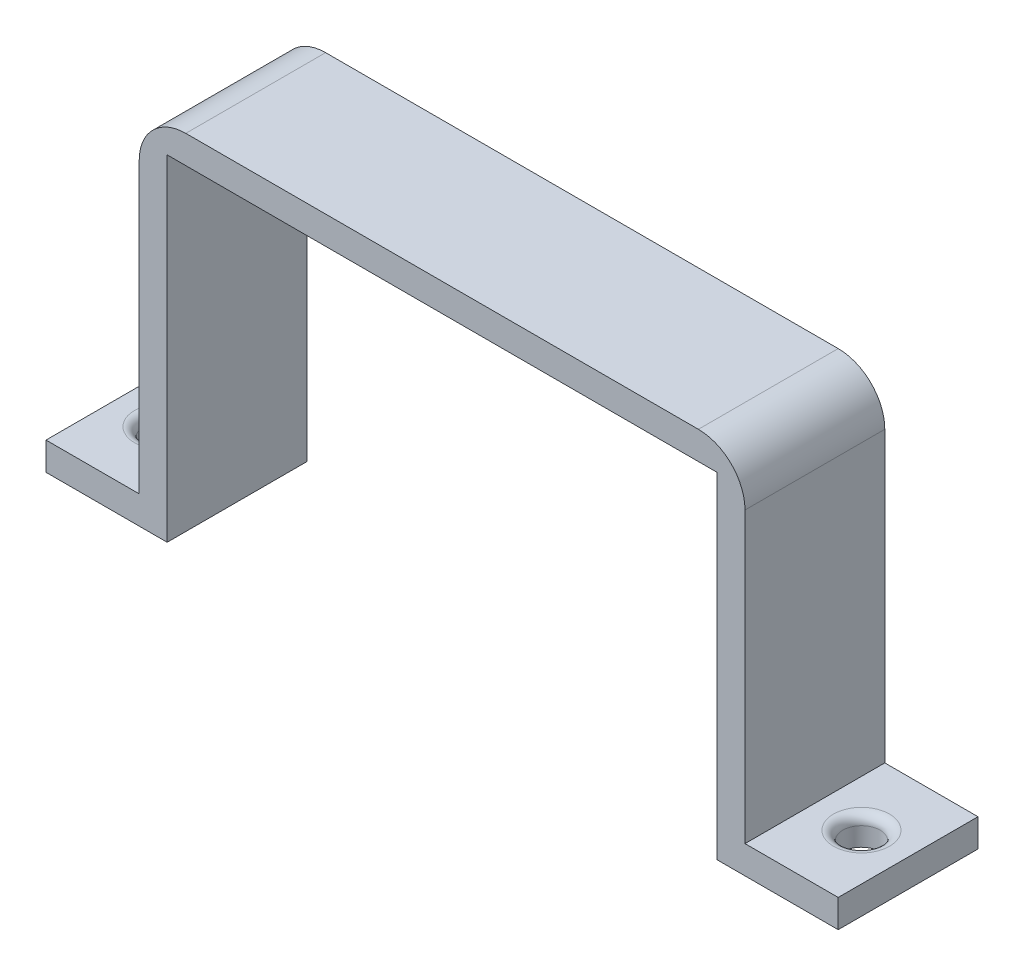
ISO-10303-21;
HEADER;
FILE_DESCRIPTION(('STEP AP214'),'2;1');
FILE_NAME('part.step','',(''),(''),'','','');
FILE_SCHEMA(('AUTOMOTIVE_DESIGN { 1 0 10303 214 1 1 1 1 }'));
ENDSEC;
DATA;
#1=APPLICATION_CONTEXT('core data for automotive mechanical design processes');
#2=APPLICATION_PROTOCOL_DEFINITION('international standard','automotive_design',2000,#1);
#3=PRODUCT_CONTEXT('',#1,'mechanical');
#4=PRODUCT('Part','Part','',(#3));
#5=PRODUCT_RELATED_PRODUCT_CATEGORY('part','',(#4));
#6=PRODUCT_DEFINITION_FORMATION('','',#4);
#7=PRODUCT_DEFINITION_CONTEXT('part definition',#1,'design');
#8=PRODUCT_DEFINITION('design','',#6,#7);
#9=PRODUCT_DEFINITION_SHAPE('','',#8);
#10=(LENGTH_UNIT() NAMED_UNIT(*) SI_UNIT(.MILLI.,.METRE.));
#11=(NAMED_UNIT(*) PLANE_ANGLE_UNIT() SI_UNIT($,.RADIAN.));
#12=(NAMED_UNIT(*) SI_UNIT($,.STERADIAN.) SOLID_ANGLE_UNIT());
#13=UNCERTAINTY_MEASURE_WITH_UNIT(LENGTH_MEASURE(1.E-05),#10,'distance_accuracy_value','');
#14=(GEOMETRIC_REPRESENTATION_CONTEXT(3) GLOBAL_UNCERTAINTY_ASSIGNED_CONTEXT((#13)) GLOBAL_UNIT_ASSIGNED_CONTEXT((#10,
#11,#12)) REPRESENTATION_CONTEXT('',''));
#15=CARTESIAN_POINT('',(0.,0.,0.));
#16=DIRECTION('',(0.,0.,1.));
#17=DIRECTION('',(1.,0.,0.));
#18=AXIS2_PLACEMENT_3D('',#15,#16,#17);
#19=CARTESIAN_POINT('',(32.5,3.,0.));
#20=DIRECTION('',(-1.,0.,0.));
#21=DIRECTION('',(0.,0.,1.));
#22=AXIS2_PLACEMENT_3D('',#19,#20,#21);
#23=PLANE('',#22);
#24=DIRECTION('',(0.,-1.,0.));
#25=VECTOR('',#24,1.);
#26=CARTESIAN_POINT('',(32.5,3.,-7.5));
#27=LINE('',#26,#25);
#28=CARTESIAN_POINT('',(32.5,-2.,-7.5));
#29=VERTEX_POINT('',#28);
#30=CARTESIAN_POINT('',(32.5,-33.,-7.5));
#31=VERTEX_POINT('',#30);
#32=EDGE_CURVE('E237',#29,#31,#27,.T.);
#33=ORIENTED_EDGE('',*,*,#32,.F.);
#34=DIRECTION('',(0.,0.,-1.));
#35=VECTOR('',#34,1.);
#36=CARTESIAN_POINT('',(32.5,-2.,7.5));
#37=LINE('',#36,#35);
#38=CARTESIAN_POINT('',(32.5,-2.,7.5));
#39=VERTEX_POINT('',#38);
#40=EDGE_CURVE('E64',#29,#39,#37,.F.);
#41=ORIENTED_EDGE('',*,*,#40,.T.);
#42=DIRECTION('',(0.,-1.,0.));
#43=VECTOR('',#42,1.);
#44=CARTESIAN_POINT('',(32.5,3.,7.5));
#45=LINE('',#44,#43);
#46=CARTESIAN_POINT('',(32.5,-33.,7.5));
#47=VERTEX_POINT('',#46);
#48=EDGE_CURVE('E239',#39,#47,#45,.T.);
#49=ORIENTED_EDGE('',*,*,#48,.T.);
#50=DIRECTION('',(0.,0.,1.));
#51=VECTOR('',#50,1.);
#52=CARTESIAN_POINT('',(32.5,-33.,7.5));
#53=LINE('',#52,#51);
#54=EDGE_CURVE('E183',#31,#47,#53,.T.);
#55=ORIENTED_EDGE('',*,*,#54,.F.);
#56=EDGE_LOOP('',(#33,#41,#49,#55));
#57=FACE_BOUND('',#56,.T.);
#58=ADVANCED_FACE('F41',(#57),#23,.F.);
#59=CARTESIAN_POINT('',(0.,0.,0.));
#60=DIRECTION('',(0.,1.,0.));
#61=DIRECTION('',(0.,0.,1.));
#62=AXIS2_PLACEMENT_3D('',#59,#60,#61);
#63=PLANE('',#62);
#64=DIRECTION('',(0.,0.,-1.));
#65=VECTOR('',#64,1.);
#66=CARTESIAN_POINT('',(29.5,0.,0.));
#67=LINE('',#66,#65);
#68=CARTESIAN_POINT('',(29.5,0.,7.5));
#69=VERTEX_POINT('',#68);
#70=CARTESIAN_POINT('',(29.5,0.,-7.5));
#71=VERTEX_POINT('',#70);
#72=EDGE_CURVE('E202',#69,#71,#67,.T.);
#73=ORIENTED_EDGE('',*,*,#72,.F.);
#74=DIRECTION('',(-1.,0.,0.));
#75=VECTOR('',#74,1.);
#76=CARTESIAN_POINT('',(0.,0.,7.5));
#77=LINE('',#76,#75);
#78=CARTESIAN_POINT('',(-29.5,0.,7.5));
#79=VERTEX_POINT('',#78);
#80=EDGE_CURVE('E226',#69,#79,#77,.T.);
#81=ORIENTED_EDGE('',*,*,#80,.T.);
#82=DIRECTION('',(0.,0.,1.));
#83=VECTOR('',#82,1.);
#84=CARTESIAN_POINT('',(-29.5,0.,0.));
#85=LINE('',#84,#83);
#86=CARTESIAN_POINT('',(-29.5,0.,-7.5));
#87=VERTEX_POINT('',#86);
#88=EDGE_CURVE('E216',#87,#79,#85,.T.);
#89=ORIENTED_EDGE('',*,*,#88,.F.);
#90=DIRECTION('',(-1.,0.,0.));
#91=VECTOR('',#90,1.);
#92=CARTESIAN_POINT('',(0.,0.,-7.5));
#93=LINE('',#92,#91);
#94=EDGE_CURVE('E230',#71,#87,#93,.T.);
#95=ORIENTED_EDGE('',*,*,#94,.F.);
#96=EDGE_LOOP('',(#73,#81,#89,#95));
#97=FACE_BOUND('',#96,.T.);
#98=ADVANCED_FACE('F280',(#97),#63,.F.);
#99=CARTESIAN_POINT('',(-32.5,3.,0.));
#100=DIRECTION('',(-1.,0.,0.));
#101=DIRECTION('',(0.,0.,1.));
#102=AXIS2_PLACEMENT_3D('',#99,#100,#101);
#103=PLANE('',#102);
#104=DIRECTION('',(0.,-1.,0.));
#105=VECTOR('',#104,1.);
#106=CARTESIAN_POINT('',(-32.5,3.,7.5));
#107=LINE('',#106,#105);
#108=CARTESIAN_POINT('',(-32.5,-2.,7.5));
#109=VERTEX_POINT('',#108);
#110=CARTESIAN_POINT('',(-32.5,-33.,7.5));
#111=VERTEX_POINT('',#110);
#112=EDGE_CURVE('E241',#109,#111,#107,.T.);
#113=ORIENTED_EDGE('',*,*,#112,.F.);
#114=DIRECTION('',(0.,0.,-1.));
#115=VECTOR('',#114,1.);
#116=CARTESIAN_POINT('',(-32.5,-2.,0.));
#117=LINE('',#116,#115);
#118=CARTESIAN_POINT('',(-32.5,-2.,-7.5));
#119=VERTEX_POINT('',#118);
#120=EDGE_CURVE('E256',#109,#119,#117,.T.);
#121=ORIENTED_EDGE('',*,*,#120,.T.);
#122=DIRECTION('',(0.,-1.,0.));
#123=VECTOR('',#122,1.);
#124=CARTESIAN_POINT('',(-32.5,3.,-7.5));
#125=LINE('',#124,#123);
#126=CARTESIAN_POINT('',(-32.5,-33.,-7.5));
#127=VERTEX_POINT('',#126);
#128=EDGE_CURVE('E233',#119,#127,#125,.T.);
#129=ORIENTED_EDGE('',*,*,#128,.T.);
#130=DIRECTION('',(0.,0.,-1.));
#131=VECTOR('',#130,1.);
#132=CARTESIAN_POINT('',(-32.5,-33.,-7.5));
#133=LINE('',#132,#131);
#134=EDGE_CURVE('E168',#111,#127,#133,.T.);
#135=ORIENTED_EDGE('',*,*,#134,.F.);
#136=EDGE_LOOP('',(#113,#121,#129,#135));
#137=FACE_BOUND('',#136,.T.);
#138=ADVANCED_FACE('F285',(#137),#103,.T.);
#139=CARTESIAN_POINT('',(0.,3.,7.5));
#140=DIRECTION('',(0.,0.,1.));
#141=DIRECTION('',(1.,0.,0.));
#142=AXIS2_PLACEMENT_3D('',#139,#140,#141);
#143=PLANE('',#142);
#144=ORIENTED_EDGE('',*,*,#48,.F.);
#145=CARTESIAN_POINT('',(27.5,-2.,7.5));
#146=DIRECTION('',(0.,0.,1.));
#147=DIRECTION('',(1.,0.,0.));
#148=AXIS2_PLACEMENT_3D('',#145,#146,#147);
#149=CIRCLE('',#148,5.);
#150=CARTESIAN_POINT('',(27.5,3.,7.5));
#151=VERTEX_POINT('',#150);
#152=EDGE_CURVE('E254',#39,#151,#149,.T.);
#153=ORIENTED_EDGE('',*,*,#152,.T.);
#154=DIRECTION('',(-1.,0.,0.));
#155=VECTOR('',#154,1.);
#156=CARTESIAN_POINT('',(0.,3.,7.5));
#157=LINE('',#156,#155);
#158=CARTESIAN_POINT('',(-27.5,3.,7.5));
#159=VERTEX_POINT('',#158);
#160=EDGE_CURVE('E227',#151,#159,#157,.T.);
#161=ORIENTED_EDGE('',*,*,#160,.T.);
#162=CARTESIAN_POINT('',(-27.5,-2.,7.5));
#163=DIRECTION('',(0.,0.,1.));
#164=DIRECTION('',(1.,0.,0.));
#165=AXIS2_PLACEMENT_3D('',#162,#163,#164);
#166=CIRCLE('',#165,5.);
#167=EDGE_CURVE('E56',#159,#109,#166,.T.);
#168=ORIENTED_EDGE('',*,*,#167,.T.);
#169=ORIENTED_EDGE('',*,*,#112,.T.);
#170=DIRECTION('',(1.,0.,0.));
#171=VECTOR('',#170,1.);
#172=CARTESIAN_POINT('',(-42.5,-33.,7.5));
#173=LINE('',#172,#171);
#174=CARTESIAN_POINT('',(-42.5,-33.,7.5));
#175=VERTEX_POINT('',#174);
#176=EDGE_CURVE('E159',#175,#111,#173,.T.);
#177=ORIENTED_EDGE('',*,*,#176,.F.);
#178=DIRECTION('',(0.,1.,0.));
#179=VECTOR('',#178,1.);
#180=CARTESIAN_POINT('',(-42.5,-33.,7.5));
#181=LINE('',#180,#179);
#182=CARTESIAN_POINT('',(-42.5,-36.,7.5));
#183=VERTEX_POINT('',#182);
#184=EDGE_CURVE('E156',#183,#175,#181,.T.);
#185=ORIENTED_EDGE('',*,*,#184,.F.);
#186=DIRECTION('',(-1.,0.,0.));
#187=VECTOR('',#186,1.);
#188=CARTESIAN_POINT('',(0.,-36.,7.5));
#189=LINE('',#188,#187);
#190=CARTESIAN_POINT('',(-29.5,-36.,7.5));
#191=VERTEX_POINT('',#190);
#192=EDGE_CURVE('E144',#191,#183,#189,.T.);
#193=ORIENTED_EDGE('',*,*,#192,.F.);
#194=DIRECTION('',(0.,1.,0.));
#195=VECTOR('',#194,1.);
#196=CARTESIAN_POINT('',(-29.5,-36.,7.5));
#197=LINE('',#196,#195);
#198=EDGE_CURVE('E153',#191,#79,#197,.T.);
#199=ORIENTED_EDGE('',*,*,#198,.T.);
#200=ORIENTED_EDGE('',*,*,#80,.F.);
#201=DIRECTION('',(0.,1.,0.));
#202=VECTOR('',#201,1.);
#203=CARTESIAN_POINT('',(29.5,-36.,7.5));
#204=LINE('',#203,#202);
#205=CARTESIAN_POINT('',(29.5,-36.,7.5));
#206=VERTEX_POINT('',#205);
#207=EDGE_CURVE('E214',#206,#69,#204,.T.);
#208=ORIENTED_EDGE('',*,*,#207,.F.);
#209=DIRECTION('',(-1.,0.,0.));
#210=VECTOR('',#209,1.);
#211=CARTESIAN_POINT('',(0.,-36.,7.5));
#212=LINE('',#211,#210);
#213=CARTESIAN_POINT('',(42.5,-36.,7.5));
#214=VERTEX_POINT('',#213);
#215=EDGE_CURVE('E203',#214,#206,#212,.T.);
#216=ORIENTED_EDGE('',*,*,#215,.F.);
#217=DIRECTION('',(0.,-1.,0.));
#218=VECTOR('',#217,1.);
#219=CARTESIAN_POINT('',(42.5,-36.,7.5));
#220=LINE('',#219,#218);
#221=CARTESIAN_POINT('',(42.5,-33.,7.5));
#222=VERTEX_POINT('',#221);
#223=EDGE_CURVE('E191',#222,#214,#220,.T.);
#224=ORIENTED_EDGE('',*,*,#223,.F.);
#225=DIRECTION('',(-1.,0.,0.));
#226=VECTOR('',#225,1.);
#227=CARTESIAN_POINT('',(42.5,-33.,7.5));
#228=LINE('',#227,#226);
#229=EDGE_CURVE('E194',#222,#47,#228,.T.);
#230=ORIENTED_EDGE('',*,*,#229,.T.);
#231=EDGE_LOOP('',(#144,#153,#161,#168,#169,#177,#185,#193,#199,#200,#208,#216,#224,#230));
#232=FACE_BOUND('',#231,.T.);
#233=ADVANCED_FACE('F157',(#232),#143,.T.);
#234=CARTESIAN_POINT('',(0.,3.,-7.5));
#235=DIRECTION('',(0.,0.,1.));
#236=DIRECTION('',(1.,0.,0.));
#237=AXIS2_PLACEMENT_3D('',#234,#235,#236);
#238=PLANE('',#237);
#239=DIRECTION('',(-1.,0.,0.));
#240=VECTOR('',#239,1.);
#241=CARTESIAN_POINT('',(0.,3.,-7.5));
#242=LINE('',#241,#240);
#243=CARTESIAN_POINT('',(27.5,3.,-7.5));
#244=VERTEX_POINT('',#243);
#245=CARTESIAN_POINT('',(-27.5,3.,-7.5));
#246=VERTEX_POINT('',#245);
#247=EDGE_CURVE('E229',#244,#246,#242,.T.);
#248=ORIENTED_EDGE('',*,*,#247,.F.);
#249=CARTESIAN_POINT('',(27.5,-2.,-7.5));
#250=DIRECTION('',(0.,0.,1.));
#251=DIRECTION('',(1.,0.,0.));
#252=AXIS2_PLACEMENT_3D('',#249,#250,#251);
#253=CIRCLE('',#252,5.);
#254=EDGE_CURVE('E250',#244,#29,#253,.F.);
#255=ORIENTED_EDGE('',*,*,#254,.T.);
#256=ORIENTED_EDGE('',*,*,#32,.T.);
#257=DIRECTION('',(-1.,0.,0.));
#258=VECTOR('',#257,1.);
#259=CARTESIAN_POINT('',(42.5,-33.,-7.5));
#260=LINE('',#259,#258);
#261=CARTESIAN_POINT('',(42.5,-33.,-7.5));
#262=VERTEX_POINT('',#261);
#263=EDGE_CURVE('E199',#262,#31,#260,.T.);
#264=ORIENTED_EDGE('',*,*,#263,.F.);
#265=DIRECTION('',(0.,1.,0.));
#266=VECTOR('',#265,1.);
#267=CARTESIAN_POINT('',(42.5,-33.,-7.5));
#268=LINE('',#267,#266);
#269=CARTESIAN_POINT('',(42.5,-36.,-7.5));
#270=VERTEX_POINT('',#269);
#271=EDGE_CURVE('E187',#270,#262,#268,.T.);
#272=ORIENTED_EDGE('',*,*,#271,.F.);
#273=DIRECTION('',(1.,0.,0.));
#274=VECTOR('',#273,1.);
#275=CARTESIAN_POINT('',(0.,-36.,-7.5));
#276=LINE('',#275,#274);
#277=CARTESIAN_POINT('',(29.5,-36.,-7.5));
#278=VERTEX_POINT('',#277);
#279=EDGE_CURVE('E208',#278,#270,#276,.T.);
#280=ORIENTED_EDGE('',*,*,#279,.F.);
#281=DIRECTION('',(0.,1.,0.));
#282=VECTOR('',#281,1.);
#283=CARTESIAN_POINT('',(29.5,-36.,-7.5));
#284=LINE('',#283,#282);
#285=EDGE_CURVE('E210',#278,#71,#284,.T.);
#286=ORIENTED_EDGE('',*,*,#285,.T.);
#287=ORIENTED_EDGE('',*,*,#94,.T.);
#288=DIRECTION('',(0.,1.,0.));
#289=VECTOR('',#288,1.);
#290=CARTESIAN_POINT('',(-29.5,-36.,-7.5));
#291=LINE('',#290,#289);
#292=CARTESIAN_POINT('',(-29.5,-36.,-7.5));
#293=VERTEX_POINT('',#292);
#294=EDGE_CURVE('E223',#293,#87,#291,.T.);
#295=ORIENTED_EDGE('',*,*,#294,.F.);
#296=DIRECTION('',(1.,0.,0.));
#297=VECTOR('',#296,1.);
#298=CARTESIAN_POINT('',(0.,-36.,-7.5));
#299=LINE('',#298,#297);
#300=CARTESIAN_POINT('',(-42.5,-36.,-7.5));
#301=VERTEX_POINT('',#300);
#302=EDGE_CURVE('E217',#301,#293,#299,.T.);
#303=ORIENTED_EDGE('',*,*,#302,.F.);
#304=DIRECTION('',(0.,-1.,0.));
#305=VECTOR('',#304,1.);
#306=CARTESIAN_POINT('',(-42.5,-36.,-7.5));
#307=LINE('',#306,#305);
#308=CARTESIAN_POINT('',(-42.5,-33.,-7.5));
#309=VERTEX_POINT('',#308);
#310=EDGE_CURVE('E167',#309,#301,#307,.T.);
#311=ORIENTED_EDGE('',*,*,#310,.F.);
#312=DIRECTION('',(1.,0.,0.));
#313=VECTOR('',#312,1.);
#314=CARTESIAN_POINT('',(-42.5,-33.,-7.5));
#315=LINE('',#314,#313);
#316=EDGE_CURVE('E178',#309,#127,#315,.T.);
#317=ORIENTED_EDGE('',*,*,#316,.T.);
#318=ORIENTED_EDGE('',*,*,#128,.F.);
#319=CARTESIAN_POINT('',(-27.5,-2.,-7.5));
#320=DIRECTION('',(0.,0.,1.));
#321=DIRECTION('',(1.,0.,0.));
#322=AXIS2_PLACEMENT_3D('',#319,#320,#321);
#323=CIRCLE('',#322,5.);
#324=EDGE_CURVE('E248',#119,#246,#323,.F.);
#325=ORIENTED_EDGE('',*,*,#324,.T.);
#326=EDGE_LOOP('',(#248,#255,#256,#264,#272,#280,#286,#287,#295,#303,#311,#317,#318,#325));
#327=FACE_BOUND('',#326,.T.);
#328=ADVANCED_FACE('F290',(#327),#238,.F.);
#329=CARTESIAN_POINT('',(0.,3.,0.));
#330=DIRECTION('',(0.,1.,0.));
#331=DIRECTION('',(0.,0.,1.));
#332=AXIS2_PLACEMENT_3D('',#329,#330,#331);
#333=PLANE('',#332);
#334=ORIENTED_EDGE('',*,*,#160,.F.);
#335=DIRECTION('',(0.,0.,-1.));
#336=VECTOR('',#335,1.);
#337=CARTESIAN_POINT('',(27.5,3.,-7.5));
#338=LINE('',#337,#336);
#339=EDGE_CURVE('E245',#151,#244,#338,.T.);
#340=ORIENTED_EDGE('',*,*,#339,.T.);
#341=ORIENTED_EDGE('',*,*,#247,.T.);
#342=DIRECTION('',(0.,0.,-1.));
#343=VECTOR('',#342,1.);
#344=CARTESIAN_POINT('',(-27.5,3.,0.));
#345=LINE('',#344,#343);
#346=EDGE_CURVE('E243',#246,#159,#345,.F.);
#347=ORIENTED_EDGE('',*,*,#346,.T.);
#348=EDGE_LOOP('',(#334,#340,#341,#347));
#349=FACE_BOUND('',#348,.T.);
#350=ADVANCED_FACE('F345',(#349),#333,.T.);
#351=CARTESIAN_POINT('',(-29.5,-36.,0.));
#352=DIRECTION('',(-1.,0.,0.));
#353=DIRECTION('',(0.,0.,1.));
#354=AXIS2_PLACEMENT_3D('',#351,#352,#353);
#355=PLANE('',#354);
#356=ORIENTED_EDGE('',*,*,#88,.T.);
#357=ORIENTED_EDGE('',*,*,#198,.F.);
#358=DIRECTION('',(0.,0.,1.));
#359=VECTOR('',#358,1.);
#360=CARTESIAN_POINT('',(-29.5,-36.,0.));
#361=LINE('',#360,#359);
#362=EDGE_CURVE('E150',#293,#191,#361,.T.);
#363=ORIENTED_EDGE('',*,*,#362,.F.);
#364=ORIENTED_EDGE('',*,*,#294,.T.);
#365=EDGE_LOOP('',(#356,#357,#363,#364));
#366=FACE_BOUND('',#365,.T.);
#367=ADVANCED_FACE('F341',(#366),#355,.F.);
#368=CARTESIAN_POINT('',(0.,-36.,0.));
#369=DIRECTION('',(0.,-1.,0.));
#370=DIRECTION('',(0.,0.,-1.));
#371=AXIS2_PLACEMENT_3D('',#368,#369,#370);
#372=PLANE('',#371);
#373=CARTESIAN_POINT('',(-37.5,-36.,0.));
#374=DIRECTION('',(0.,1.,0.));
#375=DIRECTION('',(0.,0.,1.));
#376=AXIS2_PLACEMENT_3D('',#373,#374,#375);
#377=CIRCLE('',#376,2.);
#378=CARTESIAN_POINT('',(-37.5,-36.,2.));
#379=VERTEX_POINT('',#378);
#380=EDGE_CURVE('E171',#379,#379,#377,.T.);
#381=ORIENTED_EDGE('',*,*,#380,.T.);
#382=EDGE_LOOP('',(#381));
#383=FACE_BOUND('',#382,.T.);
#384=ORIENTED_EDGE('',*,*,#192,.T.);
#385=DIRECTION('',(0.,0.,1.));
#386=VECTOR('',#385,1.);
#387=CARTESIAN_POINT('',(-42.5,-36.,7.5));
#388=LINE('',#387,#386);
#389=EDGE_CURVE('E148',#301,#183,#388,.T.);
#390=ORIENTED_EDGE('',*,*,#389,.F.);
#391=ORIENTED_EDGE('',*,*,#302,.T.);
#392=ORIENTED_EDGE('',*,*,#362,.T.);
#393=EDGE_LOOP('',(#384,#390,#391,#392));
#394=FACE_BOUND('',#393,.T.);
#395=ADVANCED_FACE('F146',(#383,#394),#372,.T.);
#396=CARTESIAN_POINT('',(29.5,-36.,0.));
#397=DIRECTION('',(1.,0.,0.));
#398=DIRECTION('',(0.,0.,-1.));
#399=AXIS2_PLACEMENT_3D('',#396,#397,#398);
#400=PLANE('',#399);
#401=ORIENTED_EDGE('',*,*,#72,.T.);
#402=ORIENTED_EDGE('',*,*,#285,.F.);
#403=DIRECTION('',(0.,0.,-1.));
#404=VECTOR('',#403,1.);
#405=CARTESIAN_POINT('',(29.5,-36.,0.));
#406=LINE('',#405,#404);
#407=EDGE_CURVE('E206',#206,#278,#406,.T.);
#408=ORIENTED_EDGE('',*,*,#407,.F.);
#409=ORIENTED_EDGE('',*,*,#207,.T.);
#410=EDGE_LOOP('',(#401,#402,#408,#409));
#411=FACE_BOUND('',#410,.T.);
#412=ADVANCED_FACE('F334',(#411),#400,.F.);
#413=CARTESIAN_POINT('',(0.,-36.,0.));
#414=DIRECTION('',(0.,-1.,0.));
#415=DIRECTION('',(0.,0.,-1.));
#416=AXIS2_PLACEMENT_3D('',#413,#414,#415);
#417=PLANE('',#416);
#418=CARTESIAN_POINT('',(37.5,-36.,0.));
#419=DIRECTION('',(0.,1.,0.));
#420=DIRECTION('',(0.,0.,1.));
#421=AXIS2_PLACEMENT_3D('',#418,#419,#420);
#422=CIRCLE('',#421,2.);
#423=CARTESIAN_POINT('',(37.5,-36.,2.));
#424=VERTEX_POINT('',#423);
#425=EDGE_CURVE('E174',#424,#424,#422,.T.);
#426=ORIENTED_EDGE('',*,*,#425,.T.);
#427=EDGE_LOOP('',(#426));
#428=FACE_BOUND('',#427,.T.);
#429=ORIENTED_EDGE('',*,*,#215,.T.);
#430=ORIENTED_EDGE('',*,*,#407,.T.);
#431=ORIENTED_EDGE('',*,*,#279,.T.);
#432=DIRECTION('',(0.,0.,-1.));
#433=VECTOR('',#432,1.);
#434=CARTESIAN_POINT('',(42.5,-36.,-7.5));
#435=LINE('',#434,#433);
#436=EDGE_CURVE('E184',#214,#270,#435,.T.);
#437=ORIENTED_EDGE('',*,*,#436,.F.);
#438=EDGE_LOOP('',(#429,#430,#431,#437));
#439=FACE_BOUND('',#438,.T.);
#440=ADVANCED_FACE('F330',(#428,#439),#417,.T.);
#441=CARTESIAN_POINT('',(42.5,-33.,7.5));
#442=DIRECTION('',(0.,-1.,0.));
#443=DIRECTION('',(0.,0.,-1.));
#444=AXIS2_PLACEMENT_3D('',#441,#442,#443);
#445=PLANE('',#444);
#446=CARTESIAN_POINT('',(37.5,-33.,0.));
#447=DIRECTION('',(0.,-1.,0.));
#448=DIRECTION('',(0.,0.,-1.));
#449=AXIS2_PLACEMENT_3D('',#446,#447,#448);
#450=CIRCLE('',#449,3.);
#451=CARTESIAN_POINT('',(37.5,-33.,-3.));
#452=VERTEX_POINT('',#451);
#453=EDGE_CURVE('E11',#452,#452,#450,.T.);
#454=ORIENTED_EDGE('',*,*,#453,.T.);
#455=EDGE_LOOP('',(#454));
#456=FACE_BOUND('',#455,.T.);
#457=ORIENTED_EDGE('',*,*,#54,.T.);
#458=ORIENTED_EDGE('',*,*,#229,.F.);
#459=DIRECTION('',(0.,0.,1.));
#460=VECTOR('',#459,1.);
#461=CARTESIAN_POINT('',(42.5,-33.,7.5));
#462=LINE('',#461,#460);
#463=EDGE_CURVE('E189',#262,#222,#462,.T.);
#464=ORIENTED_EDGE('',*,*,#463,.F.);
#465=ORIENTED_EDGE('',*,*,#263,.T.);
#466=EDGE_LOOP('',(#457,#458,#464,#465));
#467=FACE_BOUND('',#466,.T.);
#468=ADVANCED_FACE('F323',(#456,#467),#445,.F.);
#469=CARTESIAN_POINT('',(42.5,0.,0.));
#470=DIRECTION('',(-1.,0.,0.));
#471=DIRECTION('',(0.,0.,1.));
#472=AXIS2_PLACEMENT_3D('',#469,#470,#471);
#473=PLANE('',#472);
#474=ORIENTED_EDGE('',*,*,#436,.T.);
#475=ORIENTED_EDGE('',*,*,#271,.T.);
#476=ORIENTED_EDGE('',*,*,#463,.T.);
#477=ORIENTED_EDGE('',*,*,#223,.T.);
#478=EDGE_LOOP('',(#474,#475,#476,#477));
#479=FACE_BOUND('',#478,.T.);
#480=ADVANCED_FACE('F314',(#479),#473,.F.);
#481=CARTESIAN_POINT('',(-42.5,-33.,-7.5));
#482=DIRECTION('',(0.,-1.,0.));
#483=DIRECTION('',(0.,0.,-1.));
#484=AXIS2_PLACEMENT_3D('',#481,#482,#483);
#485=PLANE('',#484);
#486=CARTESIAN_POINT('',(-37.5,-33.,0.));
#487=DIRECTION('',(0.,-1.,0.));
#488=DIRECTION('',(0.,0.,-1.));
#489=AXIS2_PLACEMENT_3D('',#486,#487,#488);
#490=CIRCLE('',#489,3.);
#491=CARTESIAN_POINT('',(-37.5,-33.,-3.));
#492=VERTEX_POINT('',#491);
#493=EDGE_CURVE('E262',#492,#492,#490,.T.);
#494=ORIENTED_EDGE('',*,*,#493,.T.);
#495=EDGE_LOOP('',(#494));
#496=FACE_BOUND('',#495,.T.);
#497=ORIENTED_EDGE('',*,*,#134,.T.);
#498=ORIENTED_EDGE('',*,*,#316,.F.);
#499=DIRECTION('',(0.,0.,-1.));
#500=VECTOR('',#499,1.);
#501=CARTESIAN_POINT('',(-42.5,-33.,-7.5));
#502=LINE('',#501,#500);
#503=EDGE_CURVE('E162',#175,#309,#502,.T.);
#504=ORIENTED_EDGE('',*,*,#503,.F.);
#505=ORIENTED_EDGE('',*,*,#176,.T.);
#506=EDGE_LOOP('',(#497,#498,#504,#505));
#507=FACE_BOUND('',#506,.T.);
#508=ADVANCED_FACE('F312',(#496,#507),#485,.F.);
#509=CARTESIAN_POINT('',(-42.5,0.,0.));
#510=DIRECTION('',(1.,0.,0.));
#511=DIRECTION('',(0.,0.,-1.));
#512=AXIS2_PLACEMENT_3D('',#509,#510,#511);
#513=PLANE('',#512);
#514=ORIENTED_EDGE('',*,*,#389,.T.);
#515=ORIENTED_EDGE('',*,*,#184,.T.);
#516=ORIENTED_EDGE('',*,*,#503,.T.);
#517=ORIENTED_EDGE('',*,*,#310,.T.);
#518=EDGE_LOOP('',(#514,#515,#516,#517));
#519=FACE_BOUND('',#518,.T.);
#520=ADVANCED_FACE('F165',(#519),#513,.F.);
#521=CARTESIAN_POINT('',(-37.5,-36.,0.));
#522=DIRECTION('',(0.,1.,0.));
#523=DIRECTION('',(0.,0.,1.));
#524=AXIS2_PLACEMENT_3D('',#521,#522,#523);
#525=CYLINDRICAL_SURFACE('',#524,2.);
#526=CARTESIAN_POINT('',(-37.5,-34.,0.));
#527=DIRECTION('',(0.,-1.,0.));
#528=DIRECTION('',(0.,0.,-1.));
#529=AXIS2_PLACEMENT_3D('',#526,#527,#528);
#530=CIRCLE('',#529,2.);
#531=CARTESIAN_POINT('',(-37.5,-34.,-2.));
#532=VERTEX_POINT('',#531);
#533=EDGE_CURVE('E259',#532,#532,#530,.F.);
#534=ORIENTED_EDGE('',*,*,#533,.T.);
#535=EDGE_LOOP('',(#534));
#536=FACE_BOUND('',#535,.T.);
#537=ORIENTED_EDGE('',*,*,#380,.F.);
#538=EDGE_LOOP('',(#537));
#539=FACE_BOUND('',#538,.T.);
#540=ADVANCED_FACE('F321',(#536,#539),#525,.F.);
#541=CARTESIAN_POINT('',(37.5,-36.,0.));
#542=DIRECTION('',(0.,1.,0.));
#543=DIRECTION('',(0.,0.,1.));
#544=AXIS2_PLACEMENT_3D('',#541,#542,#543);
#545=CYLINDRICAL_SURFACE('',#544,2.);
#546=CARTESIAN_POINT('',(37.5,-34.,0.));
#547=DIRECTION('',(0.,-1.,0.));
#548=DIRECTION('',(0.,0.,-1.));
#549=AXIS2_PLACEMENT_3D('',#546,#547,#548);
#550=CIRCLE('',#549,2.);
#551=CARTESIAN_POINT('',(37.5,-34.,-2.));
#552=VERTEX_POINT('',#551);
#553=EDGE_CURVE('E49',#552,#552,#550,.F.);
#554=ORIENTED_EDGE('',*,*,#553,.T.);
#555=EDGE_LOOP('',(#554));
#556=FACE_BOUND('',#555,.T.);
#557=ORIENTED_EDGE('',*,*,#425,.F.);
#558=EDGE_LOOP('',(#557));
#559=FACE_BOUND('',#558,.T.);
#560=ADVANCED_FACE('F267',(#556,#559),#545,.F.);
#561=CARTESIAN_POINT('',(27.5,-2.,0.));
#562=DIRECTION('',(0.,0.,1.));
#563=DIRECTION('',(1.,0.,0.));
#564=AXIS2_PLACEMENT_3D('',#561,#562,#563);
#565=CYLINDRICAL_SURFACE('',#564,5.);
#566=ORIENTED_EDGE('',*,*,#152,.F.);
#567=ORIENTED_EDGE('',*,*,#40,.F.);
#568=ORIENTED_EDGE('',*,*,#254,.F.);
#569=ORIENTED_EDGE('',*,*,#339,.F.);
#570=EDGE_LOOP('',(#566,#567,#568,#569));
#571=FACE_BOUND('',#570,.T.);
#572=ADVANCED_FACE('F296',(#571),#565,.T.);
#573=CARTESIAN_POINT('',(-27.5,-2.,0.));
#574=DIRECTION('',(0.,0.,-1.));
#575=DIRECTION('',(-1.,0.,0.));
#576=AXIS2_PLACEMENT_3D('',#573,#574,#575);
#577=CYLINDRICAL_SURFACE('',#576,5.);
#578=ORIENTED_EDGE('',*,*,#167,.F.);
#579=ORIENTED_EDGE('',*,*,#346,.F.);
#580=ORIENTED_EDGE('',*,*,#324,.F.);
#581=ORIENTED_EDGE('',*,*,#120,.F.);
#582=EDGE_LOOP('',(#578,#579,#580,#581));
#583=FACE_BOUND('',#582,.T.);
#584=ADVANCED_FACE('F276',(#583),#577,.T.);
#585=CARTESIAN_POINT('',(-37.5,-34.,0.));
#586=DIRECTION('',(0.,-1.,0.));
#587=DIRECTION('',(0.,0.,-1.));
#588=AXIS2_PLACEMENT_3D('',#585,#586,#587);
#589=TOROIDAL_SURFACE('',#588,3.,1.);
#590=ORIENTED_EDGE('',*,*,#493,.F.);
#591=EDGE_LOOP('',(#590));
#592=FACE_BOUND('',#591,.T.);
#593=ORIENTED_EDGE('',*,*,#533,.F.);
#594=EDGE_LOOP('',(#593));
#595=FACE_BOUND('',#594,.T.);
#596=ADVANCED_FACE('F271',(#592,#595),#589,.T.);
#597=CARTESIAN_POINT('',(37.5,-34.,0.));
#598=DIRECTION('',(0.,-1.,0.));
#599=DIRECTION('',(0.,0.,-1.));
#600=AXIS2_PLACEMENT_3D('',#597,#598,#599);
#601=TOROIDAL_SURFACE('',#600,3.,1.);
#602=ORIENTED_EDGE('',*,*,#453,.F.);
#603=EDGE_LOOP('',(#602));
#604=FACE_BOUND('',#603,.T.);
#605=ORIENTED_EDGE('',*,*,#553,.F.);
#606=EDGE_LOOP('',(#605));
#607=FACE_BOUND('',#606,.T.);
#608=ADVANCED_FACE('F43',(#604,#607),#601,.T.);
#609=CLOSED_SHELL('',(#58,#98,#138,#233,#328,#350,#367,#395,#412,#440,#468,#480,#508,#520,#540,
#560,#572,#584,#596,#608));
#610=MANIFOLD_SOLID_BREP('B2',#609);
#611=ADVANCED_BREP_SHAPE_REPRESENTATION('',(#18,#610),#14);
#612=SHAPE_DEFINITION_REPRESENTATION(#9,#611);
ENDSEC;
END-ISO-10303-21;
